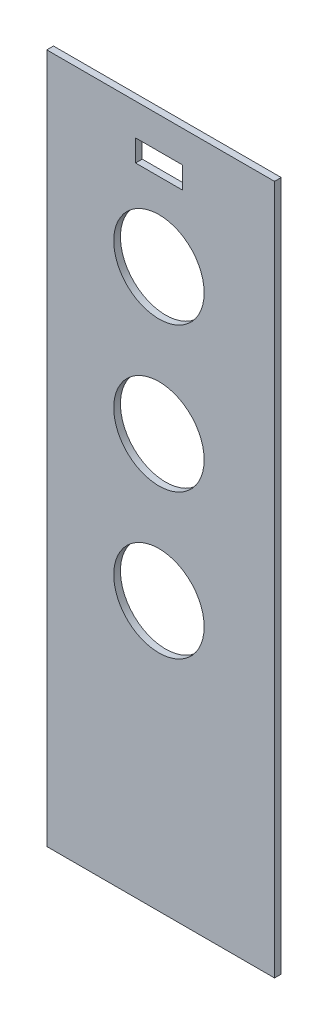
ISO-10303-21;
HEADER;
FILE_DESCRIPTION(('STEP AP214'),'2;1');
FILE_NAME('part.step','',(''),(''),'','','');
FILE_SCHEMA(('AUTOMOTIVE_DESIGN { 1 0 10303 214 1 1 1 1 }'));
ENDSEC;
DATA;
#1=APPLICATION_CONTEXT('core data for automotive mechanical design processes');
#2=APPLICATION_PROTOCOL_DEFINITION('international standard','automotive_design',2000,#1);
#3=PRODUCT_CONTEXT('',#1,'mechanical');
#4=PRODUCT('Part','Part','',(#3));
#5=PRODUCT_RELATED_PRODUCT_CATEGORY('part','',(#4));
#6=PRODUCT_DEFINITION_FORMATION('','',#4);
#7=PRODUCT_DEFINITION_CONTEXT('part definition',#1,'design');
#8=PRODUCT_DEFINITION('design','',#6,#7);
#9=PRODUCT_DEFINITION_SHAPE('','',#8);
#10=(LENGTH_UNIT() NAMED_UNIT(*) SI_UNIT(.MILLI.,.METRE.));
#11=(NAMED_UNIT(*) PLANE_ANGLE_UNIT() SI_UNIT($,.RADIAN.));
#12=(NAMED_UNIT(*) SI_UNIT($,.STERADIAN.) SOLID_ANGLE_UNIT());
#13=UNCERTAINTY_MEASURE_WITH_UNIT(LENGTH_MEASURE(1.E-05),#10,'distance_accuracy_value','');
#14=(GEOMETRIC_REPRESENTATION_CONTEXT(3) GLOBAL_UNCERTAINTY_ASSIGNED_CONTEXT((#13)) GLOBAL_UNIT_ASSIGNED_CONTEXT((#10,
#11,#12)) REPRESENTATION_CONTEXT('',''));
#15=CARTESIAN_POINT('',(0.,0.,0.));
#16=DIRECTION('',(0.,0.,1.));
#17=DIRECTION('',(1.,0.,0.));
#18=AXIS2_PLACEMENT_3D('',#15,#16,#17);
#19=CARTESIAN_POINT('',(-16.9999999999995,51.499999999999,0.5));
#20=DIRECTION('',(1.,0.,0.));
#21=DIRECTION('',(0.,0.,-1.));
#22=AXIS2_PLACEMENT_3D('',#19,#20,#21);
#23=PLANE('',#22);
#24=DIRECTION('',(0.,-1.,0.));
#25=VECTOR('',#24,1.);
#26=CARTESIAN_POINT('',(-16.9999999999995,51.499999999999,-0.5));
#27=LINE('',#26,#25);
#28=CARTESIAN_POINT('',(-16.9999999999995,51.499999999999,-0.5));
#29=VERTEX_POINT('',#28);
#30=CARTESIAN_POINT('',(-16.9999999999995,-51.500000000001,-0.5));
#31=VERTEX_POINT('',#30);
#32=EDGE_CURVE('E151',#29,#31,#27,.T.);
#33=ORIENTED_EDGE('',*,*,#32,.T.);
#34=DIRECTION('',(0.,0.,-1.));
#35=VECTOR('',#34,1.);
#36=CARTESIAN_POINT('',(-16.9999999999995,-51.500000000001,0.5));
#37=LINE('',#36,#35);
#38=CARTESIAN_POINT('',(-16.9999999999995,-51.500000000001,0.5));
#39=VERTEX_POINT('',#38);
#40=EDGE_CURVE('E11',#39,#31,#37,.T.);
#41=ORIENTED_EDGE('',*,*,#40,.F.);
#42=DIRECTION('',(0.,-1.,0.));
#43=VECTOR('',#42,1.);
#44=CARTESIAN_POINT('',(-16.9999999999995,51.499999999999,0.5));
#45=LINE('',#44,#43);
#46=CARTESIAN_POINT('',(-16.9999999999995,51.499999999999,0.5));
#47=VERTEX_POINT('',#46);
#48=EDGE_CURVE('E180',#47,#39,#45,.T.);
#49=ORIENTED_EDGE('',*,*,#48,.F.);
#50=DIRECTION('',(0.,0.,-1.));
#51=VECTOR('',#50,1.);
#52=CARTESIAN_POINT('',(-16.9999999999995,51.499999999999,0.5));
#53=LINE('',#52,#51);
#54=EDGE_CURVE('E194',#47,#29,#53,.T.);
#55=ORIENTED_EDGE('',*,*,#54,.T.);
#56=EDGE_LOOP('',(#33,#41,#49,#55));
#57=FACE_BOUND('',#56,.T.);
#58=ADVANCED_FACE('F42',(#57),#23,.F.);
#59=CARTESIAN_POINT('',(-16.9999999999995,-51.500000000001,0.5));
#60=DIRECTION('',(0.,1.,0.));
#61=DIRECTION('',(0.,0.,1.));
#62=AXIS2_PLACEMENT_3D('',#59,#60,#61);
#63=PLANE('',#62);
#64=DIRECTION('',(1.,0.,0.));
#65=VECTOR('',#64,1.);
#66=CARTESIAN_POINT('',(-16.9999999999995,-51.500000000001,-0.5));
#67=LINE('',#66,#65);
#68=CARTESIAN_POINT('',(16.9999999999995,-51.500000000001,-0.5));
#69=VERTEX_POINT('',#68);
#70=EDGE_CURVE('E198',#31,#69,#67,.T.);
#71=ORIENTED_EDGE('',*,*,#70,.T.);
#72=DIRECTION('',(0.,0.,-1.));
#73=VECTOR('',#72,1.);
#74=CARTESIAN_POINT('',(16.9999999999995,-51.500000000001,0.5));
#75=LINE('',#74,#73);
#76=CARTESIAN_POINT('',(16.9999999999995,-51.500000000001,0.5));
#77=VERTEX_POINT('',#76);
#78=EDGE_CURVE('E50',#77,#69,#75,.T.);
#79=ORIENTED_EDGE('',*,*,#78,.F.);
#80=DIRECTION('',(1.,0.,0.));
#81=VECTOR('',#80,1.);
#82=CARTESIAN_POINT('',(-16.9999999999995,-51.500000000001,0.5));
#83=LINE('',#82,#81);
#84=EDGE_CURVE('E184',#39,#77,#83,.T.);
#85=ORIENTED_EDGE('',*,*,#84,.F.);
#86=ORIENTED_EDGE('',*,*,#40,.T.);
#87=EDGE_LOOP('',(#71,#79,#85,#86));
#88=FACE_BOUND('',#87,.T.);
#89=ADVANCED_FACE('F233',(#88),#63,.F.);
#90=CARTESIAN_POINT('',(17.,51.5,0.5));
#91=DIRECTION('',(-1.,0.,0.));
#92=DIRECTION('',(0.,-1.,0.));
#93=AXIS2_PLACEMENT_3D('',#90,#91,#92);
#94=PLANE('',#93);
#95=DIRECTION('',(0.,1.,0.));
#96=VECTOR('',#95,1.);
#97=CARTESIAN_POINT('',(17.,51.5,-0.5));
#98=LINE('',#97,#96);
#99=CARTESIAN_POINT('',(17.,51.5,-0.5));
#100=VERTEX_POINT('',#99);
#101=EDGE_CURVE('E201',#69,#100,#98,.T.);
#102=ORIENTED_EDGE('',*,*,#101,.T.);
#103=DIRECTION('',(0.,0.,-1.));
#104=VECTOR('',#103,1.);
#105=CARTESIAN_POINT('',(17.,51.5,0.5));
#106=LINE('',#105,#104);
#107=CARTESIAN_POINT('',(17.,51.5,0.5));
#108=VERTEX_POINT('',#107);
#109=EDGE_CURVE('E209',#108,#100,#106,.T.);
#110=ORIENTED_EDGE('',*,*,#109,.F.);
#111=DIRECTION('',(0.,1.,0.));
#112=VECTOR('',#111,1.);
#113=CARTESIAN_POINT('',(17.,51.5,0.5));
#114=LINE('',#113,#112);
#115=EDGE_CURVE('E188',#77,#108,#114,.T.);
#116=ORIENTED_EDGE('',*,*,#115,.F.);
#117=ORIENTED_EDGE('',*,*,#78,.T.);
#118=EDGE_LOOP('',(#102,#110,#116,#117));
#119=FACE_BOUND('',#118,.T.);
#120=ADVANCED_FACE('F218',(#119),#94,.F.);
#121=CARTESIAN_POINT('',(-16.9999999999995,51.499999999999,0.5));
#122=DIRECTION('',(0.,-1.,0.));
#123=DIRECTION('',(1.,0.,0.));
#124=AXIS2_PLACEMENT_3D('',#121,#122,#123);
#125=PLANE('',#124);
#126=DIRECTION('',(-1.,0.,0.));
#127=VECTOR('',#126,1.);
#128=CARTESIAN_POINT('',(-16.9999999999995,51.499999999999,-0.5));
#129=LINE('',#128,#127);
#130=EDGE_CURVE('E185',#100,#29,#129,.T.);
#131=ORIENTED_EDGE('',*,*,#130,.T.);
#132=ORIENTED_EDGE('',*,*,#54,.F.);
#133=DIRECTION('',(-1.,0.,0.));
#134=VECTOR('',#133,1.);
#135=CARTESIAN_POINT('',(-16.9999999999995,51.499999999999,0.5));
#136=LINE('',#135,#134);
#137=EDGE_CURVE('E191',#108,#47,#136,.T.);
#138=ORIENTED_EDGE('',*,*,#137,.F.);
#139=ORIENTED_EDGE('',*,*,#109,.T.);
#140=EDGE_LOOP('',(#131,#132,#138,#139));
#141=FACE_BOUND('',#140,.T.);
#142=ADVANCED_FACE('F226',(#141),#125,.F.);
#143=CARTESIAN_POINT('',(0.,0.,0.5));
#144=DIRECTION('',(0.,0.,1.));
#145=DIRECTION('',(1.,0.,0.));
#146=AXIS2_PLACEMENT_3D('',#143,#144,#145);
#147=PLANE('',#146);
#148=DIRECTION('',(0.,-1.,0.));
#149=VECTOR('',#148,1.);
#150=CARTESIAN_POINT('',(-3.75,43.5,0.5));
#151=LINE('',#150,#149);
#152=CARTESIAN_POINT('',(-3.75,46.75,0.5));
#153=VERTEX_POINT('',#152);
#154=CARTESIAN_POINT('',(-3.75,43.5,0.5));
#155=VERTEX_POINT('',#154);
#156=EDGE_CURVE('E57',#153,#155,#151,.T.);
#157=ORIENTED_EDGE('',*,*,#156,.F.);
#158=DIRECTION('',(-1.,0.,0.));
#159=VECTOR('',#158,1.);
#160=CARTESIAN_POINT('',(-3.75,46.75,0.5));
#161=LINE('',#160,#159);
#162=CARTESIAN_POINT('',(3.25,46.75,0.5));
#163=VERTEX_POINT('',#162);
#164=EDGE_CURVE('E128',#163,#153,#161,.T.);
#165=ORIENTED_EDGE('',*,*,#164,.F.);
#166=DIRECTION('',(0.,1.,0.));
#167=VECTOR('',#166,1.);
#168=CARTESIAN_POINT('',(3.25,43.5,0.5));
#169=LINE('',#168,#167);
#170=CARTESIAN_POINT('',(3.25,43.5,0.5));
#171=VERTEX_POINT('',#170);
#172=EDGE_CURVE('E132',#171,#163,#169,.T.);
#173=ORIENTED_EDGE('',*,*,#172,.F.);
#174=DIRECTION('',(1.,0.,0.));
#175=VECTOR('',#174,1.);
#176=CARTESIAN_POINT('',(-3.75,43.5,0.5));
#177=LINE('',#176,#175);
#178=EDGE_CURVE('E141',#155,#171,#177,.T.);
#179=ORIENTED_EDGE('',*,*,#178,.F.);
#180=EDGE_LOOP('',(#157,#165,#173,#179));
#181=FACE_BOUND('',#180,.T.);
#182=CARTESIAN_POINT('',(-0.255791224993522,31.8276606419101,0.5));
#183=DIRECTION('',(0.,0.,1.));
#184=DIRECTION('',(1.,0.,0.));
#185=AXIS2_PLACEMENT_3D('',#182,#183,#184);
#186=CIRCLE('',#185,6.75);
#187=CARTESIAN_POINT('',(6.49420877500648,31.8276606419101,0.5));
#188=VERTEX_POINT('',#187);
#189=EDGE_CURVE('E142',#188,#188,#186,.T.);
#190=ORIENTED_EDGE('',*,*,#189,.F.);
#191=EDGE_LOOP('',(#190));
#192=FACE_BOUND('',#191,.T.);
#193=CARTESIAN_POINT('',(-0.255791224993374,10.2376174618241,0.5));
#194=DIRECTION('',(0.,0.,1.));
#195=DIRECTION('',(1.,0.,0.));
#196=AXIS2_PLACEMENT_3D('',#193,#194,#195);
#197=CIRCLE('',#196,6.75);
#198=CARTESIAN_POINT('',(6.49420877500663,10.2376174618241,0.5));
#199=VERTEX_POINT('',#198);
#200=EDGE_CURVE('E164',#199,#199,#197,.T.);
#201=ORIENTED_EDGE('',*,*,#200,.F.);
#202=EDGE_LOOP('',(#201));
#203=FACE_BOUND('',#202,.T.);
#204=CARTESIAN_POINT('',(-0.255791224993226,-11.3524257182619,0.5));
#205=DIRECTION('',(0.,0.,1.));
#206=DIRECTION('',(1.,0.,0.));
#207=AXIS2_PLACEMENT_3D('',#204,#205,#206);
#208=CIRCLE('',#207,6.75);
#209=CARTESIAN_POINT('',(6.49420877500677,-11.3524257182619,0.5));
#210=VERTEX_POINT('',#209);
#211=EDGE_CURVE('E172',#210,#210,#208,.T.);
#212=ORIENTED_EDGE('',*,*,#211,.F.);
#213=EDGE_LOOP('',(#212));
#214=FACE_BOUND('',#213,.T.);
#215=ORIENTED_EDGE('',*,*,#48,.T.);
#216=ORIENTED_EDGE('',*,*,#84,.T.);
#217=ORIENTED_EDGE('',*,*,#115,.T.);
#218=ORIENTED_EDGE('',*,*,#137,.T.);
#219=EDGE_LOOP('',(#215,#216,#217,#218));
#220=FACE_BOUND('',#219,.T.);
#221=ADVANCED_FACE('F232',(#181,#192,#203,#214,#220),#147,.T.);
#222=CARTESIAN_POINT('',(0.,0.,-0.5));
#223=DIRECTION('',(0.,0.,1.));
#224=DIRECTION('',(1.,0.,0.));
#225=AXIS2_PLACEMENT_3D('',#222,#223,#224);
#226=PLANE('',#225);
#227=DIRECTION('',(-1.,0.,0.));
#228=VECTOR('',#227,1.);
#229=CARTESIAN_POINT('',(-3.75,46.75,-0.5));
#230=LINE('',#229,#228);
#231=CARTESIAN_POINT('',(3.25,46.75,-0.5));
#232=VERTEX_POINT('',#231);
#233=CARTESIAN_POINT('',(-3.75,46.75,-0.5));
#234=VERTEX_POINT('',#233);
#235=EDGE_CURVE('E116',#232,#234,#230,.T.);
#236=ORIENTED_EDGE('',*,*,#235,.T.);
#237=DIRECTION('',(0.,-1.,0.));
#238=VECTOR('',#237,1.);
#239=CARTESIAN_POINT('',(-3.75,43.5,-0.5));
#240=LINE('',#239,#238);
#241=CARTESIAN_POINT('',(-3.75,43.5,-0.5));
#242=VERTEX_POINT('',#241);
#243=EDGE_CURVE('E109',#234,#242,#240,.T.);
#244=ORIENTED_EDGE('',*,*,#243,.T.);
#245=DIRECTION('',(1.,0.,0.));
#246=VECTOR('',#245,1.);
#247=CARTESIAN_POINT('',(-3.75,43.5,-0.5));
#248=LINE('',#247,#246);
#249=CARTESIAN_POINT('',(3.25,43.5,-0.5));
#250=VERTEX_POINT('',#249);
#251=EDGE_CURVE('E119',#242,#250,#248,.T.);
#252=ORIENTED_EDGE('',*,*,#251,.T.);
#253=DIRECTION('',(0.,1.,0.));
#254=VECTOR('',#253,1.);
#255=CARTESIAN_POINT('',(3.25,43.5,-0.5));
#256=LINE('',#255,#254);
#257=EDGE_CURVE('E65',#250,#232,#256,.T.);
#258=ORIENTED_EDGE('',*,*,#257,.T.);
#259=EDGE_LOOP('',(#236,#244,#252,#258));
#260=FACE_BOUND('',#259,.T.);
#261=CARTESIAN_POINT('',(-0.255791224993522,31.8276606419101,-0.5));
#262=DIRECTION('',(0.,0.,1.));
#263=DIRECTION('',(1.,0.,0.));
#264=AXIS2_PLACEMENT_3D('',#261,#262,#263);
#265=CIRCLE('',#264,6.75);
#266=CARTESIAN_POINT('',(6.49420877500648,31.8276606419101,-0.5));
#267=VERTEX_POINT('',#266);
#268=EDGE_CURVE('E160',#267,#267,#265,.T.);
#269=ORIENTED_EDGE('',*,*,#268,.T.);
#270=EDGE_LOOP('',(#269));
#271=FACE_BOUND('',#270,.T.);
#272=CARTESIAN_POINT('',(-0.255791224993374,10.2376174618241,-0.5));
#273=DIRECTION('',(0.,0.,1.));
#274=DIRECTION('',(1.,0.,0.));
#275=AXIS2_PLACEMENT_3D('',#272,#273,#274);
#276=CIRCLE('',#275,6.75);
#277=CARTESIAN_POINT('',(6.49420877500663,10.2376174618241,-0.5));
#278=VERTEX_POINT('',#277);
#279=EDGE_CURVE('E168',#278,#278,#276,.T.);
#280=ORIENTED_EDGE('',*,*,#279,.T.);
#281=EDGE_LOOP('',(#280));
#282=FACE_BOUND('',#281,.T.);
#283=CARTESIAN_POINT('',(-0.255791224993226,-11.3524257182619,-0.5));
#284=DIRECTION('',(0.,0.,1.));
#285=DIRECTION('',(1.,0.,0.));
#286=AXIS2_PLACEMENT_3D('',#283,#284,#285);
#287=CIRCLE('',#286,6.75);
#288=CARTESIAN_POINT('',(6.49420877500677,-11.3524257182619,-0.5));
#289=VERTEX_POINT('',#288);
#290=EDGE_CURVE('E176',#289,#289,#287,.T.);
#291=ORIENTED_EDGE('',*,*,#290,.T.);
#292=EDGE_LOOP('',(#291));
#293=FACE_BOUND('',#292,.T.);
#294=ORIENTED_EDGE('',*,*,#32,.F.);
#295=ORIENTED_EDGE('',*,*,#130,.F.);
#296=ORIENTED_EDGE('',*,*,#101,.F.);
#297=ORIENTED_EDGE('',*,*,#70,.F.);
#298=EDGE_LOOP('',(#294,#295,#296,#297));
#299=FACE_BOUND('',#298,.T.);
#300=ADVANCED_FACE('F124',(#260,#271,#282,#293,#299),#226,.F.);
#301=CARTESIAN_POINT('',(-0.255791224993226,-11.3524257182619,-0.5));
#302=DIRECTION('',(0.,0.,1.));
#303=DIRECTION('',(1.,0.,0.));
#304=AXIS2_PLACEMENT_3D('',#301,#302,#303);
#305=CYLINDRICAL_SURFACE('',#304,6.75);
#306=ORIENTED_EDGE('',*,*,#290,.F.);
#307=EDGE_LOOP('',(#306));
#308=FACE_BOUND('',#307,.T.);
#309=ORIENTED_EDGE('',*,*,#211,.T.);
#310=EDGE_LOOP('',(#309));
#311=FACE_BOUND('',#310,.T.);
#312=ADVANCED_FACE('F245',(#308,#311),#305,.F.);
#313=CARTESIAN_POINT('',(-0.255791224993374,10.2376174618241,-0.5));
#314=DIRECTION('',(0.,0.,1.));
#315=DIRECTION('',(1.,0.,0.));
#316=AXIS2_PLACEMENT_3D('',#313,#314,#315);
#317=CYLINDRICAL_SURFACE('',#316,6.75);
#318=ORIENTED_EDGE('',*,*,#279,.F.);
#319=EDGE_LOOP('',(#318));
#320=FACE_BOUND('',#319,.T.);
#321=ORIENTED_EDGE('',*,*,#200,.T.);
#322=EDGE_LOOP('',(#321));
#323=FACE_BOUND('',#322,.T.);
#324=ADVANCED_FACE('F251',(#320,#323),#317,.F.);
#325=CARTESIAN_POINT('',(-0.255791224993522,31.8276606419101,-0.5));
#326=DIRECTION('',(0.,0.,1.));
#327=DIRECTION('',(1.,0.,0.));
#328=AXIS2_PLACEMENT_3D('',#325,#326,#327);
#329=CYLINDRICAL_SURFACE('',#328,6.75);
#330=ORIENTED_EDGE('',*,*,#268,.F.);
#331=EDGE_LOOP('',(#330));
#332=FACE_BOUND('',#331,.T.);
#333=ORIENTED_EDGE('',*,*,#189,.T.);
#334=EDGE_LOOP('',(#333));
#335=FACE_BOUND('',#334,.T.);
#336=ADVANCED_FACE('F255',(#332,#335),#329,.F.);
#337=CARTESIAN_POINT('',(-3.75,43.5,-0.5));
#338=DIRECTION('',(-1.,0.,0.));
#339=DIRECTION('',(0.,0.,1.));
#340=AXIS2_PLACEMENT_3D('',#337,#338,#339);
#341=PLANE('',#340);
#342=ORIENTED_EDGE('',*,*,#156,.T.);
#343=DIRECTION('',(0.,0.,1.));
#344=VECTOR('',#343,1.);
#345=CARTESIAN_POINT('',(-3.75,43.5,-0.5));
#346=LINE('',#345,#344);
#347=EDGE_CURVE('E105',#242,#155,#346,.T.);
#348=ORIENTED_EDGE('',*,*,#347,.F.);
#349=ORIENTED_EDGE('',*,*,#243,.F.);
#350=DIRECTION('',(0.,0.,1.));
#351=VECTOR('',#350,1.);
#352=CARTESIAN_POINT('',(-3.75,46.75,-0.5));
#353=LINE('',#352,#351);
#354=EDGE_CURVE('E148',#234,#153,#353,.T.);
#355=ORIENTED_EDGE('',*,*,#354,.T.);
#356=EDGE_LOOP('',(#342,#348,#349,#355));
#357=FACE_BOUND('',#356,.T.);
#358=ADVANCED_FACE('F107',(#357),#341,.F.);
#359=CARTESIAN_POINT('',(-3.75,46.75,-0.5));
#360=DIRECTION('',(0.,1.,0.));
#361=DIRECTION('',(0.,0.,1.));
#362=AXIS2_PLACEMENT_3D('',#359,#360,#361);
#363=PLANE('',#362);
#364=ORIENTED_EDGE('',*,*,#164,.T.);
#365=ORIENTED_EDGE('',*,*,#354,.F.);
#366=ORIENTED_EDGE('',*,*,#235,.F.);
#367=DIRECTION('',(0.,0.,1.));
#368=VECTOR('',#367,1.);
#369=CARTESIAN_POINT('',(3.25,46.75,-0.5));
#370=LINE('',#369,#368);
#371=EDGE_CURVE('E152',#232,#163,#370,.T.);
#372=ORIENTED_EDGE('',*,*,#371,.T.);
#373=EDGE_LOOP('',(#364,#365,#366,#372));
#374=FACE_BOUND('',#373,.T.);
#375=ADVANCED_FACE('F262',(#374),#363,.F.);
#376=CARTESIAN_POINT('',(3.25,43.5,-0.5));
#377=DIRECTION('',(1.,0.,0.));
#378=DIRECTION('',(0.,0.,-1.));
#379=AXIS2_PLACEMENT_3D('',#376,#377,#378);
#380=PLANE('',#379);
#381=ORIENTED_EDGE('',*,*,#172,.T.);
#382=ORIENTED_EDGE('',*,*,#371,.F.);
#383=ORIENTED_EDGE('',*,*,#257,.F.);
#384=DIRECTION('',(0.,0.,1.));
#385=VECTOR('',#384,1.);
#386=CARTESIAN_POINT('',(3.25,43.5,-0.5));
#387=LINE('',#386,#385);
#388=EDGE_CURVE('E115',#250,#171,#387,.T.);
#389=ORIENTED_EDGE('',*,*,#388,.T.);
#390=EDGE_LOOP('',(#381,#382,#383,#389));
#391=FACE_BOUND('',#390,.T.);
#392=ADVANCED_FACE('F265',(#391),#380,.F.);
#393=CARTESIAN_POINT('',(-3.75,43.5,-0.5));
#394=DIRECTION('',(0.,-1.,0.));
#395=DIRECTION('',(0.,0.,-1.));
#396=AXIS2_PLACEMENT_3D('',#393,#394,#395);
#397=PLANE('',#396);
#398=ORIENTED_EDGE('',*,*,#178,.T.);
#399=ORIENTED_EDGE('',*,*,#388,.F.);
#400=ORIENTED_EDGE('',*,*,#251,.F.);
#401=ORIENTED_EDGE('',*,*,#347,.T.);
#402=EDGE_LOOP('',(#398,#399,#400,#401));
#403=FACE_BOUND('',#402,.T.);
#404=ADVANCED_FACE('F120',(#403),#397,.F.);
#405=CLOSED_SHELL('',(#58,#89,#120,#142,#221,#300,#312,#324,#336,#358,#375,#392,#404));
#406=MANIFOLD_SOLID_BREP('B2',#405);
#407=ADVANCED_BREP_SHAPE_REPRESENTATION('',(#18,#406),#14);
#408=SHAPE_DEFINITION_REPRESENTATION(#9,#407);
ENDSEC;
END-ISO-10303-21;
